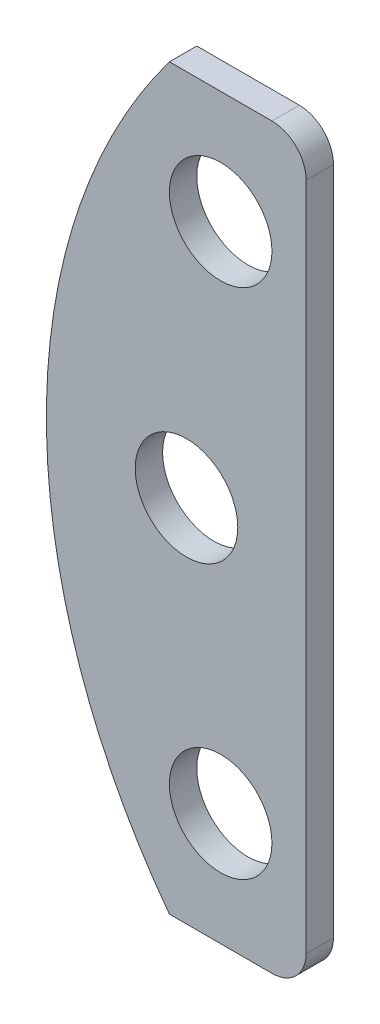
ISO-10303-21;
HEADER;
FILE_DESCRIPTION(('STEP AP214'),'2;1');
FILE_NAME('part.step','',(''),(''),'','','');
FILE_SCHEMA(('AUTOMOTIVE_DESIGN { 1 0 10303 214 1 1 1 1 }'));
ENDSEC;
DATA;
#1=APPLICATION_CONTEXT('core data for automotive mechanical design processes');
#2=APPLICATION_PROTOCOL_DEFINITION('international standard','automotive_design',2000,#1);
#3=PRODUCT_CONTEXT('',#1,'mechanical');
#4=PRODUCT('Part','Part','',(#3));
#5=PRODUCT_RELATED_PRODUCT_CATEGORY('part','',(#4));
#6=PRODUCT_DEFINITION_FORMATION('','',#4);
#7=PRODUCT_DEFINITION_CONTEXT('part definition',#1,'design');
#8=PRODUCT_DEFINITION('design','',#6,#7);
#9=PRODUCT_DEFINITION_SHAPE('','',#8);
#10=(LENGTH_UNIT() NAMED_UNIT(*) SI_UNIT(.MILLI.,.METRE.));
#11=(NAMED_UNIT(*) PLANE_ANGLE_UNIT() SI_UNIT($,.RADIAN.));
#12=(NAMED_UNIT(*) SI_UNIT($,.STERADIAN.) SOLID_ANGLE_UNIT());
#13=UNCERTAINTY_MEASURE_WITH_UNIT(LENGTH_MEASURE(1.E-05),#10,'distance_accuracy_value','');
#14=(GEOMETRIC_REPRESENTATION_CONTEXT(3) GLOBAL_UNCERTAINTY_ASSIGNED_CONTEXT((#13)) GLOBAL_UNIT_ASSIGNED_CONTEXT((#10,
#11,#12)) REPRESENTATION_CONTEXT('',''));
#15=CARTESIAN_POINT('',(0.,0.,0.));
#16=DIRECTION('',(0.,0.,1.));
#17=DIRECTION('',(1.,0.,0.));
#18=AXIS2_PLACEMENT_3D('',#15,#16,#17);
#19=CARTESIAN_POINT('',(0.,0.,4.));
#20=DIRECTION('',(0.,0.,1.));
#21=DIRECTION('',(1.,0.,0.));
#22=AXIS2_PLACEMENT_3D('',#19,#20,#21);
#23=PLANE('',#22);
#24=DIRECTION('',(1.,0.,0.));
#25=VECTOR('',#24,1.);
#26=CARTESIAN_POINT('',(-72.,-54.,4.));
#27=LINE('',#26,#25);
#28=CARTESIAN_POINT('',(-72.,-54.,4.));
#29=VERTEX_POINT('',#28);
#30=CARTESIAN_POINT('',(-57.,-54.,4.));
#31=VERTEX_POINT('',#30);
#32=EDGE_CURVE('E86',#29,#31,#27,.T.);
#33=ORIENTED_EDGE('',*,*,#32,.T.);
#34=CARTESIAN_POINT('',(-57.,-49.,4.));
#35=DIRECTION('',(0.,0.,1.));
#36=DIRECTION('',(1.,0.,0.));
#37=AXIS2_PLACEMENT_3D('',#34,#35,#36);
#38=CIRCLE('',#37,5.);
#39=CARTESIAN_POINT('',(-52.,-49.,4.));
#40=VERTEX_POINT('',#39);
#41=EDGE_CURVE('E41',#31,#40,#38,.T.);
#42=ORIENTED_EDGE('',*,*,#41,.T.);
#43=DIRECTION('',(0.,1.,0.));
#44=VECTOR('',#43,1.);
#45=CARTESIAN_POINT('',(-52.,-54.,4.));
#46=LINE('',#45,#44);
#47=CARTESIAN_POINT('',(-52.,49.,4.));
#48=VERTEX_POINT('',#47);
#49=EDGE_CURVE('E93',#40,#48,#46,.T.);
#50=ORIENTED_EDGE('',*,*,#49,.T.);
#51=CARTESIAN_POINT('',(-57.,49.,4.));
#52=DIRECTION('',(0.,0.,1.));
#53=DIRECTION('',(1.,0.,0.));
#54=AXIS2_PLACEMENT_3D('',#51,#52,#53);
#55=CIRCLE('',#54,5.);
#56=CARTESIAN_POINT('',(-57.,54.,4.));
#57=VERTEX_POINT('',#56);
#58=EDGE_CURVE('E48',#48,#57,#55,.T.);
#59=ORIENTED_EDGE('',*,*,#58,.T.);
#60=DIRECTION('',(-1.,0.,0.));
#61=VECTOR('',#60,1.);
#62=CARTESIAN_POINT('',(-52.,54.,4.));
#63=LINE('',#62,#61);
#64=CARTESIAN_POINT('',(-72.,54.,4.));
#65=VERTEX_POINT('',#64);
#66=EDGE_CURVE('E98',#57,#65,#63,.T.);
#67=ORIENTED_EDGE('',*,*,#66,.T.);
#68=CARTESIAN_POINT('',(0.,0.,4.));
#69=DIRECTION('',(0.,0.,1.));
#70=DIRECTION('',(1.,0.,0.));
#71=AXIS2_PLACEMENT_3D('',#68,#69,#70);
#72=CIRCLE('',#71,90.);
#73=EDGE_CURVE('E94',#65,#29,#72,.T.);
#74=ORIENTED_EDGE('',*,*,#73,.T.);
#75=EDGE_LOOP('',(#33,#42,#50,#59,#67,#74));
#76=FACE_BOUND('',#75,.T.);
#77=CARTESIAN_POINT('',(-64.5,-37.5,4.));
#78=DIRECTION('',(0.,0.,1.));
#79=DIRECTION('',(1.,0.,0.));
#80=AXIS2_PLACEMENT_3D('',#77,#78,#79);
#81=CIRCLE('',#80,7.5);
#82=CARTESIAN_POINT('',(-57.,-37.5,4.));
#83=VERTEX_POINT('',#82);
#84=EDGE_CURVE('E246',#83,#83,#81,.T.);
#85=ORIENTED_EDGE('',*,*,#84,.F.);
#86=EDGE_LOOP('',(#85));
#87=FACE_BOUND('',#86,.T.);
#88=CARTESIAN_POINT('',(-69.5,0.,4.));
#89=DIRECTION('',(0.,0.,1.));
#90=DIRECTION('',(1.,0.,0.));
#91=AXIS2_PLACEMENT_3D('',#88,#89,#90);
#92=CIRCLE('',#91,7.5);
#93=CARTESIAN_POINT('',(-62.,0.,4.));
#94=VERTEX_POINT('',#93);
#95=EDGE_CURVE('E250',#94,#94,#92,.T.);
#96=ORIENTED_EDGE('',*,*,#95,.F.);
#97=EDGE_LOOP('',(#96));
#98=FACE_BOUND('',#97,.T.);
#99=CARTESIAN_POINT('',(-64.5,37.5,4.));
#100=DIRECTION('',(0.,0.,1.));
#101=DIRECTION('',(1.,0.,0.));
#102=AXIS2_PLACEMENT_3D('',#99,#100,#101);
#103=CIRCLE('',#102,7.5);
#104=CARTESIAN_POINT('',(-57.,37.5,4.));
#105=VERTEX_POINT('',#104);
#106=EDGE_CURVE('E139',#105,#105,#103,.F.);
#107=ORIENTED_EDGE('',*,*,#106,.T.);
#108=EDGE_LOOP('',(#107));
#109=FACE_BOUND('',#108,.T.);
#110=ADVANCED_FACE('F33',(#76,#87,#98,#109),#23,.T.);
#111=CARTESIAN_POINT('',(0.,0.,0.));
#112=DIRECTION('',(0.,0.,1.));
#113=DIRECTION('',(1.,0.,0.));
#114=AXIS2_PLACEMENT_3D('',#111,#112,#113);
#115=PLANE('',#114);
#116=CARTESIAN_POINT('',(-69.5,0.,0.));
#117=DIRECTION('',(0.,0.,-1.));
#118=DIRECTION('',(-1.,0.,0.));
#119=AXIS2_PLACEMENT_3D('',#116,#117,#118);
#120=CIRCLE('',#119,7.5);
#121=CARTESIAN_POINT('',(-77.,0.,0.));
#122=VERTEX_POINT('',#121);
#123=EDGE_CURVE('E247',#122,#122,#120,.T.);
#124=ORIENTED_EDGE('',*,*,#123,.F.);
#125=EDGE_LOOP('',(#124));
#126=FACE_BOUND('',#125,.T.);
#127=CARTESIAN_POINT('',(-64.5,-37.5,0.));
#128=DIRECTION('',(0.,0.,-1.));
#129=DIRECTION('',(-1.,0.,0.));
#130=AXIS2_PLACEMENT_3D('',#127,#128,#129);
#131=CIRCLE('',#130,7.5);
#132=CARTESIAN_POINT('',(-72.,-37.5,0.));
#133=VERTEX_POINT('',#132);
#134=EDGE_CURVE('E253',#133,#133,#131,.T.);
#135=ORIENTED_EDGE('',*,*,#134,.F.);
#136=EDGE_LOOP('',(#135));
#137=FACE_BOUND('',#136,.T.);
#138=DIRECTION('',(0.,1.,0.));
#139=VECTOR('',#138,1.);
#140=CARTESIAN_POINT('',(-52.,-54.,0.));
#141=LINE('',#140,#139);
#142=CARTESIAN_POINT('',(-52.,-49.,0.));
#143=VERTEX_POINT('',#142);
#144=CARTESIAN_POINT('',(-52.,49.,0.));
#145=VERTEX_POINT('',#144);
#146=EDGE_CURVE('E136',#143,#145,#141,.T.);
#147=ORIENTED_EDGE('',*,*,#146,.F.);
#148=CARTESIAN_POINT('',(-57.,-49.,0.));
#149=DIRECTION('',(0.,0.,1.));
#150=DIRECTION('',(1.,0.,0.));
#151=AXIS2_PLACEMENT_3D('',#148,#149,#150);
#152=CIRCLE('',#151,5.);
#153=CARTESIAN_POINT('',(-57.,-54.,0.));
#154=VERTEX_POINT('',#153);
#155=EDGE_CURVE('E119',#143,#154,#152,.F.);
#156=ORIENTED_EDGE('',*,*,#155,.T.);
#157=DIRECTION('',(1.,0.,0.));
#158=VECTOR('',#157,1.);
#159=CARTESIAN_POINT('',(-72.,-54.,0.));
#160=LINE('',#159,#158);
#161=CARTESIAN_POINT('',(-72.,-54.,0.));
#162=VERTEX_POINT('',#161);
#163=EDGE_CURVE('E135',#162,#154,#160,.T.);
#164=ORIENTED_EDGE('',*,*,#163,.F.);
#165=CARTESIAN_POINT('',(0.,0.,0.));
#166=DIRECTION('',(0.,0.,1.));
#167=DIRECTION('',(1.,0.,0.));
#168=AXIS2_PLACEMENT_3D('',#165,#166,#167);
#169=CIRCLE('',#168,90.);
#170=CARTESIAN_POINT('',(-72.,54.,0.));
#171=VERTEX_POINT('',#170);
#172=EDGE_CURVE('E106',#171,#162,#169,.T.);
#173=ORIENTED_EDGE('',*,*,#172,.F.);
#174=DIRECTION('',(-1.,0.,0.));
#175=VECTOR('',#174,1.);
#176=CARTESIAN_POINT('',(-52.,54.,0.));
#177=LINE('',#176,#175);
#178=CARTESIAN_POINT('',(-57.,54.,0.));
#179=VERTEX_POINT('',#178);
#180=EDGE_CURVE('E102',#179,#171,#177,.T.);
#181=ORIENTED_EDGE('',*,*,#180,.F.);
#182=CARTESIAN_POINT('',(-57.,49.,0.));
#183=DIRECTION('',(0.,0.,1.));
#184=DIRECTION('',(1.,0.,0.));
#185=AXIS2_PLACEMENT_3D('',#182,#183,#184);
#186=CIRCLE('',#185,5.);
#187=EDGE_CURVE('E117',#179,#145,#186,.F.);
#188=ORIENTED_EDGE('',*,*,#187,.T.);
#189=EDGE_LOOP('',(#147,#156,#164,#173,#181,#188));
#190=FACE_BOUND('',#189,.T.);
#191=CARTESIAN_POINT('',(-64.5,37.5,0.));
#192=DIRECTION('',(0.,0.,-1.));
#193=DIRECTION('',(-1.,0.,0.));
#194=AXIS2_PLACEMENT_3D('',#191,#192,#193);
#195=CIRCLE('',#194,7.5);
#196=CARTESIAN_POINT('',(-72.,37.5,0.));
#197=VERTEX_POINT('',#196);
#198=EDGE_CURVE('E245',#197,#197,#195,.F.);
#199=ORIENTED_EDGE('',*,*,#198,.T.);
#200=EDGE_LOOP('',(#199));
#201=FACE_BOUND('',#200,.T.);
#202=ADVANCED_FACE('F133',(#126,#137,#190,#201),#115,.F.);
#203=CARTESIAN_POINT('',(0.,0.,4.));
#204=DIRECTION('',(0.,0.,-1.));
#205=DIRECTION('',(-1.,0.,0.));
#206=AXIS2_PLACEMENT_3D('',#203,#204,#205);
#207=CYLINDRICAL_SURFACE('',#206,90.);
#208=ORIENTED_EDGE('',*,*,#172,.T.);
#209=DIRECTION('',(0.,0.,-1.));
#210=VECTOR('',#209,1.);
#211=CARTESIAN_POINT('',(-72.,-54.,4.));
#212=LINE('',#211,#210);
#213=EDGE_CURVE('E90',#29,#162,#212,.T.);
#214=ORIENTED_EDGE('',*,*,#213,.F.);
#215=ORIENTED_EDGE('',*,*,#73,.F.);
#216=DIRECTION('',(0.,0.,-1.));
#217=VECTOR('',#216,1.);
#218=CARTESIAN_POINT('',(-72.,54.,4.));
#219=LINE('',#218,#217);
#220=EDGE_CURVE('E108',#65,#171,#219,.T.);
#221=ORIENTED_EDGE('',*,*,#220,.T.);
#222=EDGE_LOOP('',(#208,#214,#215,#221));
#223=FACE_BOUND('',#222,.T.);
#224=ADVANCED_FACE('F104',(#223),#207,.T.);
#225=CARTESIAN_POINT('',(-72.,-54.,4.));
#226=DIRECTION('',(0.,1.,0.));
#227=DIRECTION('',(0.,0.,1.));
#228=AXIS2_PLACEMENT_3D('',#225,#226,#227);
#229=PLANE('',#228);
#230=ORIENTED_EDGE('',*,*,#163,.T.);
#231=DIRECTION('',(0.,0.,-1.));
#232=VECTOR('',#231,1.);
#233=CARTESIAN_POINT('',(-57.,-54.,4.));
#234=LINE('',#233,#232);
#235=EDGE_CURVE('E56',#154,#31,#234,.F.);
#236=ORIENTED_EDGE('',*,*,#235,.T.);
#237=ORIENTED_EDGE('',*,*,#32,.F.);
#238=ORIENTED_EDGE('',*,*,#213,.T.);
#239=EDGE_LOOP('',(#230,#236,#237,#238));
#240=FACE_BOUND('',#239,.T.);
#241=ADVANCED_FACE('F88',(#240),#229,.F.);
#242=CARTESIAN_POINT('',(-52.,-54.,4.));
#243=DIRECTION('',(-1.,0.,0.));
#244=DIRECTION('',(0.,0.,1.));
#245=AXIS2_PLACEMENT_3D('',#242,#243,#244);
#246=PLANE('',#245);
#247=ORIENTED_EDGE('',*,*,#49,.F.);
#248=DIRECTION('',(0.,0.,-1.));
#249=VECTOR('',#248,1.);
#250=CARTESIAN_POINT('',(-52.,-49.,4.));
#251=LINE('',#250,#249);
#252=EDGE_CURVE('E110',#40,#143,#251,.T.);
#253=ORIENTED_EDGE('',*,*,#252,.T.);
#254=ORIENTED_EDGE('',*,*,#146,.T.);
#255=DIRECTION('',(0.,0.,-1.));
#256=VECTOR('',#255,1.);
#257=CARTESIAN_POINT('',(-52.,49.,4.));
#258=LINE('',#257,#256);
#259=EDGE_CURVE('E107',#145,#48,#258,.F.);
#260=ORIENTED_EDGE('',*,*,#259,.T.);
#261=EDGE_LOOP('',(#247,#253,#254,#260));
#262=FACE_BOUND('',#261,.T.);
#263=ADVANCED_FACE('F126',(#262),#246,.F.);
#264=CARTESIAN_POINT('',(-52.,54.,4.));
#265=DIRECTION('',(0.,-1.,0.));
#266=DIRECTION('',(0.,0.,-1.));
#267=AXIS2_PLACEMENT_3D('',#264,#265,#266);
#268=PLANE('',#267);
#269=ORIENTED_EDGE('',*,*,#66,.F.);
#270=DIRECTION('',(0.,0.,-1.));
#271=VECTOR('',#270,1.);
#272=CARTESIAN_POINT('',(-57.,54.,4.));
#273=LINE('',#272,#271);
#274=EDGE_CURVE('E11',#57,#179,#273,.T.);
#275=ORIENTED_EDGE('',*,*,#274,.T.);
#276=ORIENTED_EDGE('',*,*,#180,.T.);
#277=ORIENTED_EDGE('',*,*,#220,.F.);
#278=EDGE_LOOP('',(#269,#275,#276,#277));
#279=FACE_BOUND('',#278,.T.);
#280=ADVANCED_FACE('F144',(#279),#268,.F.);
#281=CARTESIAN_POINT('',(-64.5,-37.5,10.));
#282=DIRECTION('',(0.,0.,-1.));
#283=DIRECTION('',(-1.,0.,0.));
#284=AXIS2_PLACEMENT_3D('',#281,#282,#283);
#285=CYLINDRICAL_SURFACE('',#284,7.5);
#286=ORIENTED_EDGE('',*,*,#84,.T.);
#287=EDGE_LOOP('',(#286));
#288=FACE_BOUND('',#287,.T.);
#289=ORIENTED_EDGE('',*,*,#134,.T.);
#290=EDGE_LOOP('',(#289));
#291=FACE_BOUND('',#290,.T.);
#292=ADVANCED_FACE('F160',(#288,#291),#285,.F.);
#293=CARTESIAN_POINT('',(-69.5,0.,10.));
#294=DIRECTION('',(0.,0.,-1.));
#295=DIRECTION('',(-1.,0.,0.));
#296=AXIS2_PLACEMENT_3D('',#293,#294,#295);
#297=CYLINDRICAL_SURFACE('',#296,7.5);
#298=ORIENTED_EDGE('',*,*,#95,.T.);
#299=EDGE_LOOP('',(#298));
#300=FACE_BOUND('',#299,.T.);
#301=ORIENTED_EDGE('',*,*,#123,.T.);
#302=EDGE_LOOP('',(#301));
#303=FACE_BOUND('',#302,.T.);
#304=ADVANCED_FACE('F193',(#300,#303),#297,.F.);
#305=CARTESIAN_POINT('',(-64.5,37.5,10.));
#306=DIRECTION('',(0.,0.,-1.));
#307=DIRECTION('',(-1.,0.,0.));
#308=AXIS2_PLACEMENT_3D('',#305,#306,#307);
#309=CYLINDRICAL_SURFACE('',#308,7.5);
#310=ORIENTED_EDGE('',*,*,#106,.F.);
#311=EDGE_LOOP('',(#310));
#312=FACE_BOUND('',#311,.T.);
#313=ORIENTED_EDGE('',*,*,#198,.F.);
#314=EDGE_LOOP('',(#313));
#315=FACE_BOUND('',#314,.T.);
#316=ADVANCED_FACE('F151',(#312,#315),#309,.F.);
#317=CARTESIAN_POINT('',(-57.,-49.,4.));
#318=DIRECTION('',(0.,0.,-1.));
#319=DIRECTION('',(-1.,0.,0.));
#320=AXIS2_PLACEMENT_3D('',#317,#318,#319);
#321=CYLINDRICAL_SURFACE('',#320,5.);
#322=ORIENTED_EDGE('',*,*,#41,.F.);
#323=ORIENTED_EDGE('',*,*,#235,.F.);
#324=ORIENTED_EDGE('',*,*,#155,.F.);
#325=ORIENTED_EDGE('',*,*,#252,.F.);
#326=EDGE_LOOP('',(#322,#323,#324,#325));
#327=FACE_BOUND('',#326,.T.);
#328=ADVANCED_FACE('F131',(#327),#321,.T.);
#329=CARTESIAN_POINT('',(-57.,49.,4.));
#330=DIRECTION('',(0.,0.,-1.));
#331=DIRECTION('',(-1.,0.,0.));
#332=AXIS2_PLACEMENT_3D('',#329,#330,#331);
#333=CYLINDRICAL_SURFACE('',#332,5.);
#334=ORIENTED_EDGE('',*,*,#58,.F.);
#335=ORIENTED_EDGE('',*,*,#259,.F.);
#336=ORIENTED_EDGE('',*,*,#187,.F.);
#337=ORIENTED_EDGE('',*,*,#274,.F.);
#338=EDGE_LOOP('',(#334,#335,#336,#337));
#339=FACE_BOUND('',#338,.T.);
#340=ADVANCED_FACE('F35',(#339),#333,.T.);
#341=CLOSED_SHELL('',(#110,#202,#224,#241,#263,#280,#292,#304,#316,#328,#340));
#342=MANIFOLD_SOLID_BREP('B2',#341);
#343=ADVANCED_BREP_SHAPE_REPRESENTATION('',(#18,#342),#14);
#344=SHAPE_DEFINITION_REPRESENTATION(#9,#343);
ENDSEC;
END-ISO-10303-21;
